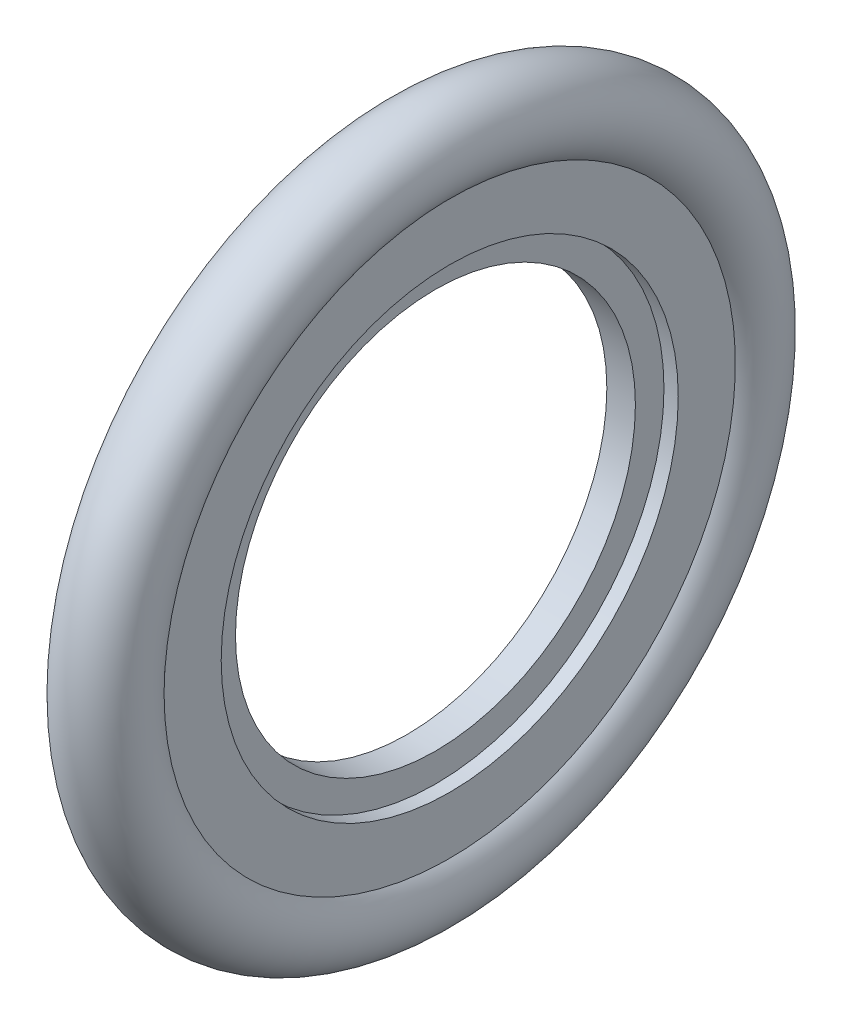
ISO-10303-21;
HEADER;
FILE_DESCRIPTION(('STEP AP214'),'2;1');
FILE_NAME('part.step','',(''),(''),'','','');
FILE_SCHEMA(('AUTOMOTIVE_DESIGN { 1 0 10303 214 1 1 1 1 }'));
ENDSEC;
DATA;
#1=APPLICATION_CONTEXT('core data for automotive mechanical design processes');
#2=APPLICATION_PROTOCOL_DEFINITION('international standard','automotive_design',2000,#1);
#3=PRODUCT_CONTEXT('',#1,'mechanical');
#4=PRODUCT('Part','Part','',(#3));
#5=PRODUCT_RELATED_PRODUCT_CATEGORY('part','',(#4));
#6=PRODUCT_DEFINITION_FORMATION('','',#4);
#7=PRODUCT_DEFINITION_CONTEXT('part definition',#1,'design');
#8=PRODUCT_DEFINITION('design','',#6,#7);
#9=PRODUCT_DEFINITION_SHAPE('','',#8);
#10=(LENGTH_UNIT() NAMED_UNIT(*) SI_UNIT(.MILLI.,.METRE.));
#11=(NAMED_UNIT(*) PLANE_ANGLE_UNIT() SI_UNIT($,.RADIAN.));
#12=(NAMED_UNIT(*) SI_UNIT($,.STERADIAN.) SOLID_ANGLE_UNIT());
#13=UNCERTAINTY_MEASURE_WITH_UNIT(LENGTH_MEASURE(1.E-05),#10,'distance_accuracy_value','');
#14=(GEOMETRIC_REPRESENTATION_CONTEXT(3) GLOBAL_UNCERTAINTY_ASSIGNED_CONTEXT((#13)) GLOBAL_UNIT_ASSIGNED_CONTEXT((#10,
#11,#12)) REPRESENTATION_CONTEXT('',''));
#15=CARTESIAN_POINT('',(0.,0.,0.));
#16=DIRECTION('',(0.,0.,1.));
#17=DIRECTION('',(1.,0.,0.));
#18=AXIS2_PLACEMENT_3D('',#15,#16,#17);
#19=CARTESIAN_POINT('',(0.,0.,0.));
#20=DIRECTION('',(-1.,0.,0.));
#21=DIRECTION('',(0.,0.,1.));
#22=AXIS2_PLACEMENT_3D('',#19,#20,#21);
#23=TOROIDAL_SURFACE('',#22,70.1675,9.2075);
#24=CARTESIAN_POINT('',(6.35,0.,0.));
#25=DIRECTION('',(-1.,0.,0.));
#26=DIRECTION('',(0.,0.,1.));
#27=AXIS2_PLACEMENT_3D('',#24,#25,#26);
#28=CIRCLE('',#27,63.5);
#29=CARTESIAN_POINT('',(6.35,0.,63.5));
#30=VERTEX_POINT('',#29);
#31=EDGE_CURVE('E61',#30,#30,#28,.T.);
#32=ORIENTED_EDGE('',*,*,#31,.T.);
#33=EDGE_LOOP('',(#32));
#34=FACE_BOUND('',#33,.T.);
#35=CARTESIAN_POINT('',(-6.35,0.,0.));
#36=DIRECTION('',(-1.,0.,0.));
#37=DIRECTION('',(0.,0.,1.));
#38=AXIS2_PLACEMENT_3D('',#35,#36,#37);
#39=CIRCLE('',#38,63.5);
#40=CARTESIAN_POINT('',(-6.35,0.,63.5));
#41=VERTEX_POINT('',#40);
#42=EDGE_CURVE('E10',#41,#41,#39,.T.);
#43=ORIENTED_EDGE('',*,*,#42,.F.);
#44=EDGE_LOOP('',(#43));
#45=FACE_BOUND('',#44,.T.);
#46=ADVANCED_FACE('F33',(#34,#45),#23,.T.);
#47=CARTESIAN_POINT('',(-6.35,0.,0.));
#48=DIRECTION('',(-1.,0.,0.));
#49=DIRECTION('',(0.,0.,1.));
#50=AXIS2_PLACEMENT_3D('',#47,#48,#49);
#51=PLANE('',#50);
#52=ORIENTED_EDGE('',*,*,#42,.T.);
#53=EDGE_LOOP('',(#52));
#54=FACE_BOUND('',#53,.T.);
#55=CARTESIAN_POINT('',(-6.35,0.,0.));
#56=DIRECTION('',(-1.,0.,0.));
#57=DIRECTION('',(0.,0.,1.));
#58=AXIS2_PLACEMENT_3D('',#55,#56,#57);
#59=CIRCLE('',#58,50.8);
#60=CARTESIAN_POINT('',(-6.35,0.,50.8));
#61=VERTEX_POINT('',#60);
#62=EDGE_CURVE('E39',#61,#61,#59,.T.);
#63=ORIENTED_EDGE('',*,*,#62,.F.);
#64=EDGE_LOOP('',(#63));
#65=FACE_BOUND('',#64,.T.);
#66=ADVANCED_FACE('F97',(#54,#65),#51,.T.);
#67=CARTESIAN_POINT('',(0.,0.,0.));
#68=DIRECTION('',(-1.,0.,0.));
#69=DIRECTION('',(0.,0.,1.));
#70=AXIS2_PLACEMENT_3D('',#67,#68,#69);
#71=CYLINDRICAL_SURFACE('',#70,50.8);
#72=ORIENTED_EDGE('',*,*,#62,.T.);
#73=EDGE_LOOP('',(#72));
#74=FACE_BOUND('',#73,.T.);
#75=CARTESIAN_POINT('',(-3.175,0.,0.));
#76=DIRECTION('',(-1.,0.,0.));
#77=DIRECTION('',(0.,0.,1.));
#78=AXIS2_PLACEMENT_3D('',#75,#76,#77);
#79=CIRCLE('',#78,50.8);
#80=CARTESIAN_POINT('',(-3.175,0.,50.8));
#81=VERTEX_POINT('',#80);
#82=EDGE_CURVE('E43',#81,#81,#79,.T.);
#83=ORIENTED_EDGE('',*,*,#82,.F.);
#84=EDGE_LOOP('',(#83));
#85=FACE_BOUND('',#84,.T.);
#86=ADVANCED_FACE('F93',(#74,#85),#71,.F.);
#87=CARTESIAN_POINT('',(-3.175,0.,0.));
#88=DIRECTION('',(-1.,0.,0.));
#89=DIRECTION('',(0.,0.,1.));
#90=AXIS2_PLACEMENT_3D('',#87,#88,#89);
#91=PLANE('',#90);
#92=ORIENTED_EDGE('',*,*,#82,.T.);
#93=EDGE_LOOP('',(#92));
#94=FACE_BOUND('',#93,.T.);
#95=CARTESIAN_POINT('',(-3.175,0.,0.));
#96=DIRECTION('',(-1.,0.,0.));
#97=DIRECTION('',(0.,0.,1.));
#98=AXIS2_PLACEMENT_3D('',#95,#96,#97);
#99=CIRCLE('',#98,44.45);
#100=CARTESIAN_POINT('',(-3.175,0.,44.45));
#101=VERTEX_POINT('',#100);
#102=EDGE_CURVE('E47',#101,#101,#99,.T.);
#103=ORIENTED_EDGE('',*,*,#102,.F.);
#104=EDGE_LOOP('',(#103));
#105=FACE_BOUND('',#104,.T.);
#106=ADVANCED_FACE('F87',(#94,#105),#91,.T.);
#107=CARTESIAN_POINT('',(0.,0.,0.));
#108=DIRECTION('',(-1.,0.,0.));
#109=DIRECTION('',(0.,0.,1.));
#110=AXIS2_PLACEMENT_3D('',#107,#108,#109);
#111=CYLINDRICAL_SURFACE('',#110,44.45);
#112=ORIENTED_EDGE('',*,*,#102,.T.);
#113=EDGE_LOOP('',(#112));
#114=FACE_BOUND('',#113,.T.);
#115=CARTESIAN_POINT('',(3.175,0.,0.));
#116=DIRECTION('',(-1.,0.,0.));
#117=DIRECTION('',(0.,0.,1.));
#118=AXIS2_PLACEMENT_3D('',#115,#116,#117);
#119=CIRCLE('',#118,44.45);
#120=CARTESIAN_POINT('',(3.175,0.,44.45));
#121=VERTEX_POINT('',#120);
#122=EDGE_CURVE('E52',#121,#121,#119,.T.);
#123=ORIENTED_EDGE('',*,*,#122,.F.);
#124=EDGE_LOOP('',(#123));
#125=FACE_BOUND('',#124,.T.);
#126=ADVANCED_FACE('F82',(#114,#125),#111,.F.);
#127=CARTESIAN_POINT('',(3.175,0.,0.));
#128=DIRECTION('',(-1.,0.,0.));
#129=DIRECTION('',(0.,0.,1.));
#130=AXIS2_PLACEMENT_3D('',#127,#128,#129);
#131=PLANE('',#130);
#132=CARTESIAN_POINT('',(3.175,0.,0.));
#133=DIRECTION('',(-1.,0.,0.));
#134=DIRECTION('',(0.,0.,1.));
#135=AXIS2_PLACEMENT_3D('',#132,#133,#134);
#136=CIRCLE('',#135,50.8);
#137=CARTESIAN_POINT('',(3.175,0.,50.8));
#138=VERTEX_POINT('',#137);
#139=EDGE_CURVE('E55',#138,#138,#136,.T.);
#140=ORIENTED_EDGE('',*,*,#139,.F.);
#141=EDGE_LOOP('',(#140));
#142=FACE_BOUND('',#141,.T.);
#143=ORIENTED_EDGE('',*,*,#122,.T.);
#144=EDGE_LOOP('',(#143));
#145=FACE_BOUND('',#144,.T.);
#146=ADVANCED_FACE('F76',(#142,#145),#131,.F.);
#147=CARTESIAN_POINT('',(0.,0.,0.));
#148=DIRECTION('',(-1.,0.,0.));
#149=DIRECTION('',(0.,0.,1.));
#150=AXIS2_PLACEMENT_3D('',#147,#148,#149);
#151=CYLINDRICAL_SURFACE('',#150,50.8);
#152=CARTESIAN_POINT('',(6.35,0.,0.));
#153=DIRECTION('',(-1.,0.,0.));
#154=DIRECTION('',(0.,0.,1.));
#155=AXIS2_PLACEMENT_3D('',#152,#153,#154);
#156=CIRCLE('',#155,50.8);
#157=CARTESIAN_POINT('',(6.35,0.,50.8));
#158=VERTEX_POINT('',#157);
#159=EDGE_CURVE('E58',#158,#158,#156,.T.);
#160=ORIENTED_EDGE('',*,*,#159,.F.);
#161=EDGE_LOOP('',(#160));
#162=FACE_BOUND('',#161,.T.);
#163=ORIENTED_EDGE('',*,*,#139,.T.);
#164=EDGE_LOOP('',(#163));
#165=FACE_BOUND('',#164,.T.);
#166=ADVANCED_FACE('F70',(#162,#165),#151,.F.);
#167=CARTESIAN_POINT('',(6.35,0.,0.));
#168=DIRECTION('',(-1.,0.,0.));
#169=DIRECTION('',(0.,0.,1.));
#170=AXIS2_PLACEMENT_3D('',#167,#168,#169);
#171=PLANE('',#170);
#172=ORIENTED_EDGE('',*,*,#31,.F.);
#173=EDGE_LOOP('',(#172));
#174=FACE_BOUND('',#173,.T.);
#175=ORIENTED_EDGE('',*,*,#159,.T.);
#176=EDGE_LOOP('',(#175));
#177=FACE_BOUND('',#176,.T.);
#178=ADVANCED_FACE('F67',(#174,#177),#171,.F.);
#179=CLOSED_SHELL('',(#46,#66,#86,#106,#126,#146,#166,#178));
#180=MANIFOLD_SOLID_BREP('B2',#179);
#181=ADVANCED_BREP_SHAPE_REPRESENTATION('',(#18,#180),#14);
#182=SHAPE_DEFINITION_REPRESENTATION(#9,#181);
ENDSEC;
END-ISO-10303-21;
